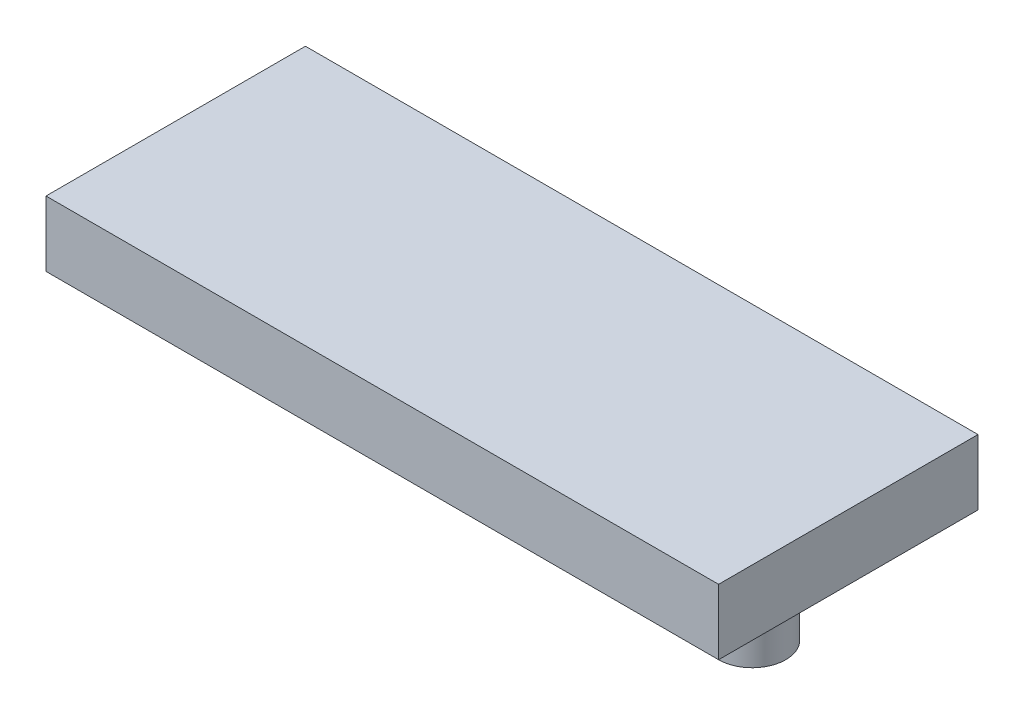
ISO-10303-21;
HEADER;
FILE_DESCRIPTION(('STEP AP214'),'2;1');
FILE_NAME('part.step','',(''),(''),'','','');
FILE_SCHEMA(('AUTOMOTIVE_DESIGN { 1 0 10303 214 1 1 1 1 }'));
ENDSEC;
DATA;
#1=APPLICATION_CONTEXT('core data for automotive mechanical design processes');
#2=APPLICATION_PROTOCOL_DEFINITION('international standard','automotive_design',2000,#1);
#3=PRODUCT_CONTEXT('',#1,'mechanical');
#4=PRODUCT('Part','Part','',(#3));
#5=PRODUCT_RELATED_PRODUCT_CATEGORY('part','',(#4));
#6=PRODUCT_DEFINITION_FORMATION('','',#4);
#7=PRODUCT_DEFINITION_CONTEXT('part definition',#1,'design');
#8=PRODUCT_DEFINITION('design','',#6,#7);
#9=PRODUCT_DEFINITION_SHAPE('','',#8);
#10=(LENGTH_UNIT() NAMED_UNIT(*) SI_UNIT(.MILLI.,.METRE.));
#11=(NAMED_UNIT(*) PLANE_ANGLE_UNIT() SI_UNIT($,.RADIAN.));
#12=(NAMED_UNIT(*) SI_UNIT($,.STERADIAN.) SOLID_ANGLE_UNIT());
#13=UNCERTAINTY_MEASURE_WITH_UNIT(LENGTH_MEASURE(1.E-05),#10,'distance_accuracy_value','');
#14=(GEOMETRIC_REPRESENTATION_CONTEXT(3) GLOBAL_UNCERTAINTY_ASSIGNED_CONTEXT((#13)) GLOBAL_UNIT_ASSIGNED_CONTEXT((#10,
#11,#12)) REPRESENTATION_CONTEXT('',''));
#15=CARTESIAN_POINT('',(0.,0.,0.));
#16=DIRECTION('',(0.,0.,1.));
#17=DIRECTION('',(1.,0.,0.));
#18=AXIS2_PLACEMENT_3D('',#15,#16,#17);
#19=CARTESIAN_POINT('',(-3.175,-1.27,0.));
#20=DIRECTION('',(0.,-1.,0.));
#21=DIRECTION('',(0.,0.,-1.));
#22=AXIS2_PLACEMENT_3D('',#19,#20,#21);
#23=PLANE('',#22);
#24=CARTESIAN_POINT('',(-3.175,-1.27,0.));
#25=DIRECTION('',(0.,-1.,0.));
#26=DIRECTION('',(0.,0.,-1.));
#27=AXIS2_PLACEMENT_3D('',#24,#25,#26);
#28=CIRCLE('',#27,0.4445);
#29=CARTESIAN_POINT('',(-3.175,-1.27,-0.4445));
#30=VERTEX_POINT('',#29);
#31=EDGE_CURVE('E20',#30,#30,#28,.F.);
#32=ORIENTED_EDGE('',*,*,#31,.F.);
#33=EDGE_LOOP('',(#32));
#34=FACE_BOUND('',#33,.T.);
#35=ADVANCED_FACE('F17',(#34),#23,.T.);
#36=CARTESIAN_POINT('',(3.175,-1.27,0.));
#37=DIRECTION('',(0.,-1.,0.));
#38=DIRECTION('',(0.,0.,-1.));
#39=AXIS2_PLACEMENT_3D('',#36,#37,#38);
#40=PLANE('',#39);
#41=CARTESIAN_POINT('',(3.175,-1.27,0.));
#42=DIRECTION('',(0.,-1.,0.));
#43=DIRECTION('',(0.,0.,-1.));
#44=AXIS2_PLACEMENT_3D('',#41,#42,#43);
#45=CIRCLE('',#44,0.4445);
#46=CARTESIAN_POINT('',(3.175,-1.27,-0.4445));
#47=VERTEX_POINT('',#46);
#48=EDGE_CURVE('E98',#47,#47,#45,.F.);
#49=ORIENTED_EDGE('',*,*,#48,.F.);
#50=EDGE_LOOP('',(#49));
#51=FACE_BOUND('',#50,.T.);
#52=ADVANCED_FACE('F111',(#51),#40,.T.);
#53=CARTESIAN_POINT('',(-3.175,-1.27,0.));
#54=DIRECTION('',(0.,-1.,0.));
#55=DIRECTION('',(0.,0.,-1.));
#56=AXIS2_PLACEMENT_3D('',#53,#54,#55);
#57=CYLINDRICAL_SURFACE('',#56,0.4445);
#58=CARTESIAN_POINT('',(-3.175,0.,0.));
#59=DIRECTION('',(0.,-1.,0.));
#60=DIRECTION('',(0.,0.,-1.));
#61=AXIS2_PLACEMENT_3D('',#58,#59,#60);
#62=CIRCLE('',#61,0.4445);
#63=CARTESIAN_POINT('',(-3.175,0.,-0.4445));
#64=VERTEX_POINT('',#63);
#65=EDGE_CURVE('E95',#64,#64,#62,.T.);
#66=ORIENTED_EDGE('',*,*,#65,.T.);
#67=EDGE_LOOP('',(#66));
#68=FACE_BOUND('',#67,.T.);
#69=ORIENTED_EDGE('',*,*,#31,.T.);
#70=EDGE_LOOP('',(#69));
#71=FACE_BOUND('',#70,.T.);
#72=ADVANCED_FACE('F108',(#68,#71),#57,.T.);
#73=CARTESIAN_POINT('',(3.175,-1.27,0.));
#74=DIRECTION('',(0.,-1.,0.));
#75=DIRECTION('',(0.,0.,-1.));
#76=AXIS2_PLACEMENT_3D('',#73,#74,#75);
#77=CYLINDRICAL_SURFACE('',#76,0.4445);
#78=CARTESIAN_POINT('',(3.175,0.,0.));
#79=DIRECTION('',(0.,-1.,0.));
#80=DIRECTION('',(0.,0.,-1.));
#81=AXIS2_PLACEMENT_3D('',#78,#79,#80);
#82=CIRCLE('',#81,0.4445);
#83=CARTESIAN_POINT('',(3.175,0.,-0.4445));
#84=VERTEX_POINT('',#83);
#85=EDGE_CURVE('E74',#84,#84,#82,.T.);
#86=ORIENTED_EDGE('',*,*,#85,.T.);
#87=EDGE_LOOP('',(#86));
#88=FACE_BOUND('',#87,.T.);
#89=ORIENTED_EDGE('',*,*,#48,.T.);
#90=EDGE_LOOP('',(#89));
#91=FACE_BOUND('',#90,.T.);
#92=ADVANCED_FACE('F138',(#88,#91),#77,.T.);
#93=CARTESIAN_POINT('',(0.,0.,0.));
#94=DIRECTION('',(0.,1.,0.));
#95=DIRECTION('',(0.,0.,1.));
#96=AXIS2_PLACEMENT_3D('',#93,#94,#95);
#97=PLANE('',#96);
#98=DIRECTION('',(1.,0.,0.));
#99=VECTOR('',#98,1.);
#100=CARTESIAN_POINT('',(4.445,0.,-1.7145));
#101=LINE('',#100,#99);
#102=CARTESIAN_POINT('',(-4.445,0.,-1.7145));
#103=VERTEX_POINT('',#102);
#104=CARTESIAN_POINT('',(4.445,0.,-1.7145));
#105=VERTEX_POINT('',#104);
#106=EDGE_CURVE('E244',#103,#105,#101,.T.);
#107=ORIENTED_EDGE('',*,*,#106,.T.);
#108=DIRECTION('',(0.,0.,1.));
#109=VECTOR('',#108,1.);
#110=CARTESIAN_POINT('',(4.445,0.,1.7145));
#111=LINE('',#110,#109);
#112=CARTESIAN_POINT('',(4.445,0.,1.7145));
#113=VERTEX_POINT('',#112);
#114=EDGE_CURVE('E78',#105,#113,#111,.T.);
#115=ORIENTED_EDGE('',*,*,#114,.T.);
#116=DIRECTION('',(-1.,0.,0.));
#117=VECTOR('',#116,1.);
#118=CARTESIAN_POINT('',(-4.445,0.,1.7145));
#119=LINE('',#118,#117);
#120=CARTESIAN_POINT('',(-4.445,0.,1.7145));
#121=VERTEX_POINT('',#120);
#122=EDGE_CURVE('E59',#113,#121,#119,.T.);
#123=ORIENTED_EDGE('',*,*,#122,.T.);
#124=DIRECTION('',(0.,0.,-1.));
#125=VECTOR('',#124,1.);
#126=CARTESIAN_POINT('',(-4.445,0.,-1.7145));
#127=LINE('',#126,#125);
#128=EDGE_CURVE('E64',#121,#103,#127,.T.);
#129=ORIENTED_EDGE('',*,*,#128,.T.);
#130=EDGE_LOOP('',(#107,#115,#123,#129));
#131=FACE_BOUND('',#130,.T.);
#132=ORIENTED_EDGE('',*,*,#85,.F.);
#133=EDGE_LOOP('',(#132));
#134=FACE_BOUND('',#133,.T.);
#135=ORIENTED_EDGE('',*,*,#65,.F.);
#136=EDGE_LOOP('',(#135));
#137=FACE_BOUND('',#136,.T.);
#138=ADVANCED_FACE('F76',(#131,#134,#137),#97,.F.);
#139=CARTESIAN_POINT('',(-4.445,0.8636,-1.7145));
#140=DIRECTION('',(1.,0.,0.));
#141=DIRECTION('',(0.,0.,-1.));
#142=AXIS2_PLACEMENT_3D('',#139,#140,#141);
#143=PLANE('',#142);
#144=DIRECTION('',(0.,1.,0.));
#145=VECTOR('',#144,1.);
#146=CARTESIAN_POINT('',(-4.445,0.8636,1.7145));
#147=LINE('',#146,#145);
#148=CARTESIAN_POINT('',(-4.445,0.8636,1.7145));
#149=VERTEX_POINT('',#148);
#150=EDGE_CURVE('E66',#121,#149,#147,.T.);
#151=ORIENTED_EDGE('',*,*,#150,.T.);
#152=DIRECTION('',(0.,0.,1.));
#153=VECTOR('',#152,1.);
#154=CARTESIAN_POINT('',(-4.445,0.8636,0.));
#155=LINE('',#154,#153);
#156=CARTESIAN_POINT('',(-4.445,0.8636,-1.7145));
#157=VERTEX_POINT('',#156);
#158=EDGE_CURVE('E239',#157,#149,#155,.T.);
#159=ORIENTED_EDGE('',*,*,#158,.F.);
#160=DIRECTION('',(0.,1.,0.));
#161=VECTOR('',#160,1.);
#162=CARTESIAN_POINT('',(-4.445,0.8636,-1.7145));
#163=LINE('',#162,#161);
#164=EDGE_CURVE('E69',#157,#103,#163,.F.);
#165=ORIENTED_EDGE('',*,*,#164,.T.);
#166=ORIENTED_EDGE('',*,*,#128,.F.);
#167=EDGE_LOOP('',(#151,#159,#165,#166));
#168=FACE_BOUND('',#167,.T.);
#169=ADVANCED_FACE('F65',(#168),#143,.F.);
#170=CARTESIAN_POINT('',(-4.445,0.8636,1.7145));
#171=DIRECTION('',(0.,0.,-1.));
#172=DIRECTION('',(-1.,0.,0.));
#173=AXIS2_PLACEMENT_3D('',#170,#171,#172);
#174=PLANE('',#173);
#175=DIRECTION('',(0.,1.,0.));
#176=VECTOR('',#175,1.);
#177=CARTESIAN_POINT('',(4.445,0.8636,1.7145));
#178=LINE('',#177,#176);
#179=CARTESIAN_POINT('',(4.445,0.8636,1.7145));
#180=VERTEX_POINT('',#179);
#181=EDGE_CURVE('E81',#113,#180,#178,.T.);
#182=ORIENTED_EDGE('',*,*,#181,.T.);
#183=DIRECTION('',(1.,0.,0.));
#184=VECTOR('',#183,1.);
#185=CARTESIAN_POINT('',(0.,0.8636,1.7145));
#186=LINE('',#185,#184);
#187=EDGE_CURVE('E85',#149,#180,#186,.T.);
#188=ORIENTED_EDGE('',*,*,#187,.F.);
#189=ORIENTED_EDGE('',*,*,#150,.F.);
#190=ORIENTED_EDGE('',*,*,#122,.F.);
#191=EDGE_LOOP('',(#182,#188,#189,#190));
#192=FACE_BOUND('',#191,.T.);
#193=ADVANCED_FACE('F83',(#192),#174,.F.);
#194=CARTESIAN_POINT('',(4.445,0.8636,1.7145));
#195=DIRECTION('',(-1.,0.,0.));
#196=DIRECTION('',(0.,0.,1.));
#197=AXIS2_PLACEMENT_3D('',#194,#195,#196);
#198=PLANE('',#197);
#199=DIRECTION('',(0.,1.,0.));
#200=VECTOR('',#199,1.);
#201=CARTESIAN_POINT('',(4.445,0.8636,-1.7145));
#202=LINE('',#201,#200);
#203=CARTESIAN_POINT('',(4.445,0.8636,-1.7145));
#204=VERTEX_POINT('',#203);
#205=EDGE_CURVE('E36',#105,#204,#202,.T.);
#206=ORIENTED_EDGE('',*,*,#205,.T.);
#207=DIRECTION('',(0.,0.,1.));
#208=VECTOR('',#207,1.);
#209=CARTESIAN_POINT('',(4.445,0.8636,0.));
#210=LINE('',#209,#208);
#211=EDGE_CURVE('E27',#180,#204,#210,.F.);
#212=ORIENTED_EDGE('',*,*,#211,.F.);
#213=ORIENTED_EDGE('',*,*,#181,.F.);
#214=ORIENTED_EDGE('',*,*,#114,.F.);
#215=EDGE_LOOP('',(#206,#212,#213,#214));
#216=FACE_BOUND('',#215,.T.);
#217=ADVANCED_FACE('F125',(#216),#198,.F.);
#218=CARTESIAN_POINT('',(4.445,0.8636,-1.7145));
#219=DIRECTION('',(0.,0.,1.));
#220=DIRECTION('',(1.,0.,0.));
#221=AXIS2_PLACEMENT_3D('',#218,#219,#220);
#222=PLANE('',#221);
#223=ORIENTED_EDGE('',*,*,#164,.F.);
#224=DIRECTION('',(1.,0.,0.));
#225=VECTOR('',#224,1.);
#226=CARTESIAN_POINT('',(0.,0.8636,-1.7145));
#227=LINE('',#226,#225);
#228=EDGE_CURVE('E11',#204,#157,#227,.F.);
#229=ORIENTED_EDGE('',*,*,#228,.F.);
#230=ORIENTED_EDGE('',*,*,#205,.F.);
#231=ORIENTED_EDGE('',*,*,#106,.F.);
#232=EDGE_LOOP('',(#223,#229,#230,#231));
#233=FACE_BOUND('',#232,.T.);
#234=ADVANCED_FACE('F119',(#233),#222,.F.);
#235=CARTESIAN_POINT('',(0.,0.8636,0.));
#236=DIRECTION('',(0.,1.,0.));
#237=DIRECTION('',(0.,0.,1.));
#238=AXIS2_PLACEMENT_3D('',#235,#236,#237);
#239=PLANE('',#238);
#240=ORIENTED_EDGE('',*,*,#211,.T.);
#241=ORIENTED_EDGE('',*,*,#228,.T.);
#242=ORIENTED_EDGE('',*,*,#158,.T.);
#243=ORIENTED_EDGE('',*,*,#187,.T.);
#244=EDGE_LOOP('',(#240,#241,#242,#243));
#245=FACE_BOUND('',#244,.T.);
#246=ADVANCED_FACE('F117',(#245),#239,.T.);
#247=CLOSED_SHELL('',(#35,#52,#72,#92,#138,#169,#193,#217,#234,#246));
#248=MANIFOLD_SOLID_BREP('B1',#247);
#249=ADVANCED_BREP_SHAPE_REPRESENTATION('',(#18,#248),#14);
#250=SHAPE_DEFINITION_REPRESENTATION(#9,#249);
ENDSEC;
END-ISO-10303-21;
